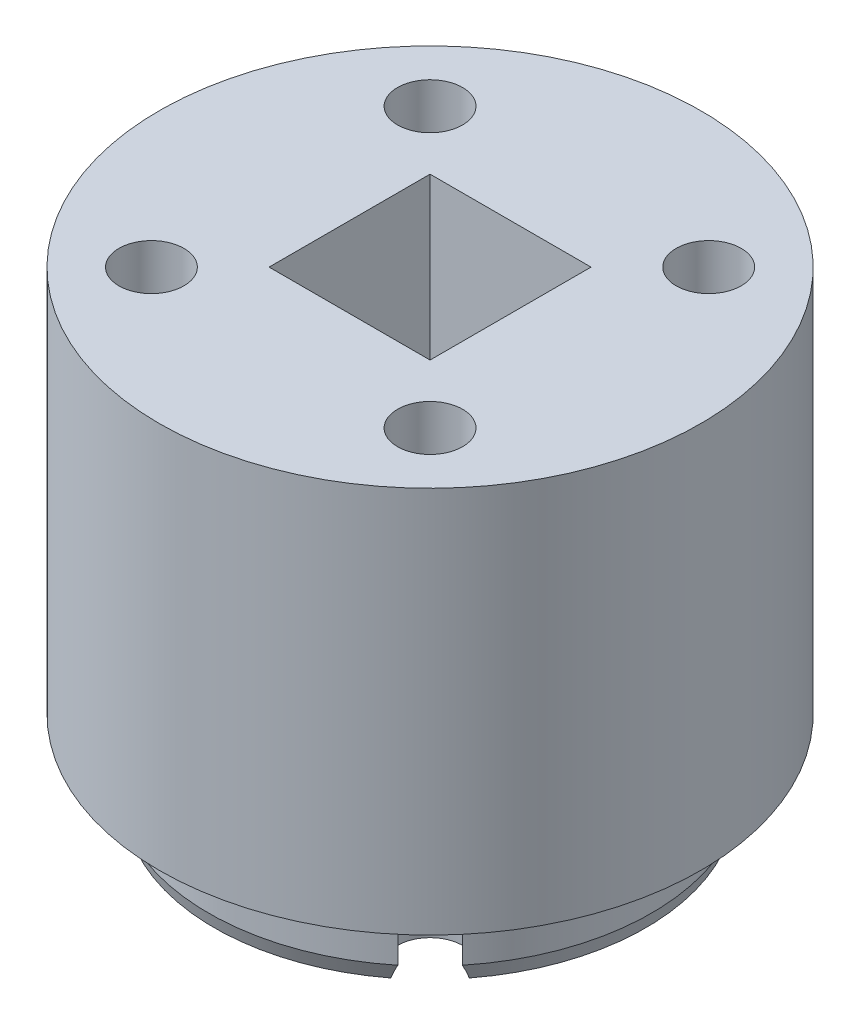
ISO-10303-21;
HEADER;
FILE_DESCRIPTION(('STEP AP214'),'2;1');
FILE_NAME('part.step','',(''),(''),'','','');
FILE_SCHEMA(('AUTOMOTIVE_DESIGN { 1 0 10303 214 1 1 1 1 }'));
ENDSEC;
DATA;
#1=APPLICATION_CONTEXT('core data for automotive mechanical design processes');
#2=APPLICATION_PROTOCOL_DEFINITION('international standard','automotive_design',2000,#1);
#3=PRODUCT_CONTEXT('',#1,'mechanical');
#4=PRODUCT('Part','Part','',(#3));
#5=PRODUCT_RELATED_PRODUCT_CATEGORY('part','',(#4));
#6=PRODUCT_DEFINITION_FORMATION('','',#4);
#7=PRODUCT_DEFINITION_CONTEXT('part definition',#1,'design');
#8=PRODUCT_DEFINITION('design','',#6,#7);
#9=PRODUCT_DEFINITION_SHAPE('','',#8);
#10=(LENGTH_UNIT() NAMED_UNIT(*) SI_UNIT(.MILLI.,.METRE.));
#11=(NAMED_UNIT(*) PLANE_ANGLE_UNIT() SI_UNIT($,.RADIAN.));
#12=(NAMED_UNIT(*) SI_UNIT($,.STERADIAN.) SOLID_ANGLE_UNIT());
#13=UNCERTAINTY_MEASURE_WITH_UNIT(LENGTH_MEASURE(1.E-05),#10,'distance_accuracy_value','');
#14=(GEOMETRIC_REPRESENTATION_CONTEXT(3) GLOBAL_UNCERTAINTY_ASSIGNED_CONTEXT((#13)) GLOBAL_UNIT_ASSIGNED_CONTEXT((#10,
#11,#12)) REPRESENTATION_CONTEXT('',''));
#15=CARTESIAN_POINT('',(0.,0.,0.));
#16=DIRECTION('',(0.,0.,1.));
#17=DIRECTION('',(1.,0.,0.));
#18=AXIS2_PLACEMENT_3D('',#15,#16,#17);
#19=CARTESIAN_POINT('',(0.,-5.,0.));
#20=DIRECTION('',(0.,1.,0.));
#21=DIRECTION('',(0.,0.,1.));
#22=AXIS2_PLACEMENT_3D('',#19,#20,#21);
#23=CYLINDRICAL_SURFACE('',#22,14.3);
#24=DIRECTION('',(0.,1.,0.));
#25=VECTOR('',#24,1.);
#26=CARTESIAN_POINT('',(-9.01561360028965,10.,11.0999419552659));
#27=LINE('',#26,#25);
#28=CARTESIAN_POINT('',(-9.01561360028965,0.,11.0999419552659));
#29=VERTEX_POINT('',#28);
#30=CARTESIAN_POINT('',(-9.01561360028965,-3.99999999999996,11.0999419552659));
#31=VERTEX_POINT('',#30);
#32=EDGE_CURVE('E211',#29,#31,#27,.F.);
#33=ORIENTED_EDGE('',*,*,#32,.T.);
#34=CARTESIAN_POINT('',(0.,-3.99999999999996,0.));
#35=DIRECTION('',(0.,-1.,0.));
#36=DIRECTION('',(0.,0.,-1.));
#37=AXIS2_PLACEMENT_3D('',#34,#35,#36);
#38=CIRCLE('',#37,14.3);
#39=CARTESIAN_POINT('',(9.01561360028965,-3.99999999999996,11.0999419552659));
#40=VERTEX_POINT('',#39);
#41=EDGE_CURVE('E11',#31,#40,#38,.F.);
#42=ORIENTED_EDGE('',*,*,#41,.T.);
#43=DIRECTION('',(0.,1.,0.));
#44=VECTOR('',#43,1.);
#45=CARTESIAN_POINT('',(9.01561360028965,10.,11.0999419552659));
#46=LINE('',#45,#44);
#47=CARTESIAN_POINT('',(9.01561360028965,0.,11.0999419552659));
#48=VERTEX_POINT('',#47);
#49=EDGE_CURVE('E216',#40,#48,#46,.T.);
#50=ORIENTED_EDGE('',*,*,#49,.T.);
#51=CARTESIAN_POINT('',(0.,0.,0.));
#52=DIRECTION('',(0.,1.,0.));
#53=DIRECTION('',(0.,0.,1.));
#54=AXIS2_PLACEMENT_3D('',#51,#52,#53);
#55=CIRCLE('',#54,14.3);
#56=EDGE_CURVE('E179',#48,#29,#55,.F.);
#57=ORIENTED_EDGE('',*,*,#56,.T.);
#58=EDGE_LOOP('',(#33,#42,#50,#57));
#59=FACE_BOUND('',#58,.T.);
#60=ADVANCED_FACE('F34',(#59),#23,.T.);
#61=DIRECTION('',(0.,1.,0.));
#62=VECTOR('',#61,1.);
#63=CARTESIAN_POINT('',(-11.0999419552659,10.,-9.01561360028966));
#64=LINE('',#63,#62);
#65=CARTESIAN_POINT('',(-11.0999419552659,0.,-9.01561360028966));
#66=VERTEX_POINT('',#65);
#67=CARTESIAN_POINT('',(-11.0999419552659,-3.99999999999996,-9.01561360028966));
#68=VERTEX_POINT('',#67);
#69=EDGE_CURVE('E193',#66,#68,#64,.F.);
#70=ORIENTED_EDGE('',*,*,#69,.T.);
#71=CARTESIAN_POINT('',(0.,-3.99999999999996,0.));
#72=DIRECTION('',(0.,-1.,0.));
#73=DIRECTION('',(0.,0.,-1.));
#74=AXIS2_PLACEMENT_3D('',#71,#72,#73);
#75=CIRCLE('',#74,14.3);
#76=CARTESIAN_POINT('',(-11.0999419552659,-3.99999999999996,9.01561360028965));
#77=VERTEX_POINT('',#76);
#78=EDGE_CURVE('E58',#68,#77,#75,.F.);
#79=ORIENTED_EDGE('',*,*,#78,.T.);
#80=DIRECTION('',(0.,1.,0.));
#81=VECTOR('',#80,1.);
#82=CARTESIAN_POINT('',(-11.0999419552659,10.,9.01561360028965));
#83=LINE('',#82,#81);
#84=CARTESIAN_POINT('',(-11.0999419552659,0.,9.01561360028965));
#85=VERTEX_POINT('',#84);
#86=EDGE_CURVE('E194',#77,#85,#83,.T.);
#87=ORIENTED_EDGE('',*,*,#86,.T.);
#88=EDGE_CURVE('E180',#85,#66,#55,.F.);
#89=ORIENTED_EDGE('',*,*,#88,.T.);
#90=EDGE_LOOP('',(#70,#79,#87,#89));
#91=FACE_BOUND('',#90,.T.);
#92=ADVANCED_FACE('F192',(#91),#23,.T.);
#93=DIRECTION('',(0.,1.,0.));
#94=VECTOR('',#93,1.);
#95=CARTESIAN_POINT('',(9.01561360028965,10.,-11.0999419552659));
#96=LINE('',#95,#94);
#97=CARTESIAN_POINT('',(9.01561360028965,0.,-11.0999419552659));
#98=VERTEX_POINT('',#97);
#99=CARTESIAN_POINT('',(9.01561360028965,-3.99999999999996,-11.0999419552659));
#100=VERTEX_POINT('',#99);
#101=EDGE_CURVE('E164',#98,#100,#96,.F.);
#102=ORIENTED_EDGE('',*,*,#101,.T.);
#103=CARTESIAN_POINT('',(0.,-3.99999999999996,0.));
#104=DIRECTION('',(0.,-1.,0.));
#105=DIRECTION('',(0.,0.,-1.));
#106=AXIS2_PLACEMENT_3D('',#103,#104,#105);
#107=CIRCLE('',#106,14.3);
#108=CARTESIAN_POINT('',(-9.01561360028966,-3.99999999999996,-11.0999419552659));
#109=VERTEX_POINT('',#108);
#110=EDGE_CURVE('E330',#100,#109,#107,.F.);
#111=ORIENTED_EDGE('',*,*,#110,.T.);
#112=DIRECTION('',(0.,1.,0.));
#113=VECTOR('',#112,1.);
#114=CARTESIAN_POINT('',(-9.01561360028966,10.,-11.0999419552659));
#115=LINE('',#114,#113);
#116=CARTESIAN_POINT('',(-9.01561360028966,0.,-11.0999419552659));
#117=VERTEX_POINT('',#116);
#118=EDGE_CURVE('E203',#109,#117,#115,.T.);
#119=ORIENTED_EDGE('',*,*,#118,.T.);
#120=EDGE_CURVE('E176',#117,#98,#55,.F.);
#121=ORIENTED_EDGE('',*,*,#120,.T.);
#122=EDGE_LOOP('',(#102,#111,#119,#121));
#123=FACE_BOUND('',#122,.T.);
#124=ADVANCED_FACE('F265',(#123),#23,.T.);
#125=CARTESIAN_POINT('',(0.,25.,0.));
#126=DIRECTION('',(0.,-1.,0.));
#127=DIRECTION('',(0.,0.,-1.));
#128=AXIS2_PLACEMENT_3D('',#125,#126,#127);
#129=CYLINDRICAL_SURFACE('',#128,17.5);
#130=CARTESIAN_POINT('',(0.,25.,0.));
#131=DIRECTION('',(0.,1.,0.));
#132=DIRECTION('',(0.,0.,1.));
#133=AXIS2_PLACEMENT_3D('',#130,#131,#132);
#134=CIRCLE('',#133,17.5);
#135=CARTESIAN_POINT('',(0.,25.,17.5));
#136=VERTEX_POINT('',#135);
#137=EDGE_CURVE('E177',#136,#136,#134,.T.);
#138=ORIENTED_EDGE('',*,*,#137,.F.);
#139=EDGE_LOOP('',(#138));
#140=FACE_BOUND('',#139,.T.);
#141=CARTESIAN_POINT('',(0.,0.,0.));
#142=DIRECTION('',(0.,1.,0.));
#143=DIRECTION('',(0.,0.,1.));
#144=AXIS2_PLACEMENT_3D('',#141,#142,#143);
#145=CIRCLE('',#144,17.5);
#146=CARTESIAN_POINT('',(0.,0.,17.5));
#147=VERTEX_POINT('',#146);
#148=EDGE_CURVE('E182',#147,#147,#145,.T.);
#149=ORIENTED_EDGE('',*,*,#148,.T.);
#150=EDGE_LOOP('',(#149));
#151=FACE_BOUND('',#150,.T.);
#152=ADVANCED_FACE('F255',(#140,#151),#129,.T.);
#153=CARTESIAN_POINT('',(0.,25.,0.));
#154=DIRECTION('',(0.,1.,0.));
#155=DIRECTION('',(0.,0.,1.));
#156=AXIS2_PLACEMENT_3D('',#153,#154,#155);
#157=PLANE('',#156);
#158=CARTESIAN_POINT('',(-9.,25.,9.));
#159=DIRECTION('',(0.,1.,0.));
#160=DIRECTION('',(0.,0.,1.));
#161=AXIS2_PLACEMENT_3D('',#158,#159,#160);
#162=CIRCLE('',#161,2.1);
#163=CARTESIAN_POINT('',(-9.,25.,11.1));
#164=VERTEX_POINT('',#163);
#165=EDGE_CURVE('E159',#164,#164,#162,.T.);
#166=ORIENTED_EDGE('',*,*,#165,.F.);
#167=EDGE_LOOP('',(#166));
#168=FACE_BOUND('',#167,.T.);
#169=CARTESIAN_POINT('',(-9.00000000000001,25.,-9.));
#170=DIRECTION('',(0.,1.,0.));
#171=DIRECTION('',(0.,0.,1.));
#172=AXIS2_PLACEMENT_3D('',#169,#170,#171);
#173=CIRCLE('',#172,2.1);
#174=CARTESIAN_POINT('',(-9.00000000000001,25.,-6.9));
#175=VERTEX_POINT('',#174);
#176=EDGE_CURVE('E533',#175,#175,#173,.T.);
#177=ORIENTED_EDGE('',*,*,#176,.F.);
#178=EDGE_LOOP('',(#177));
#179=FACE_BOUND('',#178,.T.);
#180=CARTESIAN_POINT('',(9.,25.,-9.));
#181=DIRECTION('',(0.,1.,0.));
#182=DIRECTION('',(0.,0.,1.));
#183=AXIS2_PLACEMENT_3D('',#180,#181,#182);
#184=CIRCLE('',#183,2.1);
#185=CARTESIAN_POINT('',(9.,25.,-6.9));
#186=VERTEX_POINT('',#185);
#187=EDGE_CURVE('E530',#186,#186,#184,.T.);
#188=ORIENTED_EDGE('',*,*,#187,.F.);
#189=EDGE_LOOP('',(#188));
#190=FACE_BOUND('',#189,.T.);
#191=CARTESIAN_POINT('',(9.,25.,9.));
#192=DIRECTION('',(0.,1.,0.));
#193=DIRECTION('',(0.,0.,1.));
#194=AXIS2_PLACEMENT_3D('',#191,#192,#193);
#195=CIRCLE('',#194,2.1);
#196=CARTESIAN_POINT('',(9.,25.,11.1));
#197=VERTEX_POINT('',#196);
#198=EDGE_CURVE('E213',#197,#197,#195,.T.);
#199=ORIENTED_EDGE('',*,*,#198,.F.);
#200=EDGE_LOOP('',(#199));
#201=FACE_BOUND('',#200,.T.);
#202=DIRECTION('',(0.,0.,-1.));
#203=VECTOR('',#202,1.);
#204=CARTESIAN_POINT('',(5.2,25.,-5.2));
#205=LINE('',#204,#203);
#206=CARTESIAN_POINT('',(5.2,25.,5.2));
#207=VERTEX_POINT('',#206);
#208=CARTESIAN_POINT('',(5.2,25.,-5.2));
#209=VERTEX_POINT('',#208);
#210=EDGE_CURVE('E221',#207,#209,#205,.T.);
#211=ORIENTED_EDGE('',*,*,#210,.F.);
#212=DIRECTION('',(1.,0.,0.));
#213=VECTOR('',#212,1.);
#214=CARTESIAN_POINT('',(-5.2,25.,5.2));
#215=LINE('',#214,#213);
#216=CARTESIAN_POINT('',(-5.2,25.,5.2));
#217=VERTEX_POINT('',#216);
#218=EDGE_CURVE('E226',#217,#207,#215,.T.);
#219=ORIENTED_EDGE('',*,*,#218,.F.);
#220=DIRECTION('',(0.,0.,1.));
#221=VECTOR('',#220,1.);
#222=CARTESIAN_POINT('',(-5.2,25.,-5.2));
#223=LINE('',#222,#221);
#224=CARTESIAN_POINT('',(-5.2,25.,-5.2));
#225=VERTEX_POINT('',#224);
#226=EDGE_CURVE('E240',#225,#217,#223,.T.);
#227=ORIENTED_EDGE('',*,*,#226,.F.);
#228=DIRECTION('',(-1.,0.,0.));
#229=VECTOR('',#228,1.);
#230=CARTESIAN_POINT('',(-5.2,25.,-5.2));
#231=LINE('',#230,#229);
#232=EDGE_CURVE('E237',#209,#225,#231,.T.);
#233=ORIENTED_EDGE('',*,*,#232,.F.);
#234=EDGE_LOOP('',(#211,#219,#227,#233));
#235=FACE_BOUND('',#234,.T.);
#236=ORIENTED_EDGE('',*,*,#137,.T.);
#237=EDGE_LOOP('',(#236));
#238=FACE_BOUND('',#237,.T.);
#239=ADVANCED_FACE('F257',(#168,#179,#190,#201,#235,#238),#157,.T.);
#240=CARTESIAN_POINT('',(0.,0.,0.));
#241=DIRECTION('',(0.,1.,0.));
#242=DIRECTION('',(0.,0.,1.));
#243=AXIS2_PLACEMENT_3D('',#240,#241,#242);
#244=PLANE('',#243);
#245=ORIENTED_EDGE('',*,*,#88,.F.);
#246=CARTESIAN_POINT('',(-9.,0.,9.));
#247=DIRECTION('',(0.,1.,0.));
#248=DIRECTION('',(0.,0.,1.));
#249=AXIS2_PLACEMENT_3D('',#246,#247,#248);
#250=CIRCLE('',#249,2.1);
#251=EDGE_CURVE('E198',#85,#29,#250,.T.);
#252=ORIENTED_EDGE('',*,*,#251,.T.);
#253=ORIENTED_EDGE('',*,*,#56,.F.);
#254=CARTESIAN_POINT('',(9.,0.,9.));
#255=DIRECTION('',(0.,1.,0.));
#256=DIRECTION('',(0.,0.,1.));
#257=AXIS2_PLACEMENT_3D('',#254,#255,#256);
#258=CIRCLE('',#257,2.1);
#259=CARTESIAN_POINT('',(11.0999419552659,0.,9.01561360028965));
#260=VERTEX_POINT('',#259);
#261=EDGE_CURVE('E175',#48,#260,#258,.T.);
#262=ORIENTED_EDGE('',*,*,#261,.T.);
#263=CARTESIAN_POINT('',(11.0999419552659,0.,-9.01561360028965));
#264=VERTEX_POINT('',#263);
#265=EDGE_CURVE('E152',#264,#260,#55,.F.);
#266=ORIENTED_EDGE('',*,*,#265,.F.);
#267=CARTESIAN_POINT('',(9.,0.,-9.));
#268=DIRECTION('',(0.,1.,0.));
#269=DIRECTION('',(0.,0.,1.));
#270=AXIS2_PLACEMENT_3D('',#267,#268,#269);
#271=CIRCLE('',#270,2.1);
#272=EDGE_CURVE('E158',#264,#98,#271,.T.);
#273=ORIENTED_EDGE('',*,*,#272,.T.);
#274=ORIENTED_EDGE('',*,*,#120,.F.);
#275=CARTESIAN_POINT('',(-9.00000000000001,0.,-9.));
#276=DIRECTION('',(0.,1.,0.));
#277=DIRECTION('',(0.,0.,1.));
#278=AXIS2_PLACEMENT_3D('',#275,#276,#277);
#279=CIRCLE('',#278,2.1);
#280=EDGE_CURVE('E200',#117,#66,#279,.T.);
#281=ORIENTED_EDGE('',*,*,#280,.T.);
#282=EDGE_LOOP('',(#245,#252,#253,#262,#266,#273,#274,#281));
#283=FACE_BOUND('',#282,.T.);
#284=ORIENTED_EDGE('',*,*,#148,.F.);
#285=EDGE_LOOP('',(#284));
#286=FACE_BOUND('',#285,.T.);
#287=ADVANCED_FACE('F171',(#283,#286),#244,.F.);
#288=DIRECTION('',(0.,1.,0.));
#289=VECTOR('',#288,1.);
#290=CARTESIAN_POINT('',(11.0999419552659,10.,9.01561360028965));
#291=LINE('',#290,#289);
#292=CARTESIAN_POINT('',(11.0999419552659,-3.99999999999996,9.01561360028965));
#293=VERTEX_POINT('',#292);
#294=EDGE_CURVE('E219',#260,#293,#291,.F.);
#295=ORIENTED_EDGE('',*,*,#294,.T.);
#296=CARTESIAN_POINT('',(0.,-3.99999999999996,0.));
#297=DIRECTION('',(0.,-1.,0.));
#298=DIRECTION('',(0.,0.,-1.));
#299=AXIS2_PLACEMENT_3D('',#296,#297,#298);
#300=CIRCLE('',#299,14.3);
#301=CARTESIAN_POINT('',(11.0999419552659,-3.99999999999996,-9.01561360028965));
#302=VERTEX_POINT('',#301);
#303=EDGE_CURVE('E155',#293,#302,#300,.F.);
#304=ORIENTED_EDGE('',*,*,#303,.T.);
#305=DIRECTION('',(0.,1.,0.));
#306=VECTOR('',#305,1.);
#307=CARTESIAN_POINT('',(11.0999419552659,10.,-9.01561360028965));
#308=LINE('',#307,#306);
#309=EDGE_CURVE('E147',#302,#264,#308,.T.);
#310=ORIENTED_EDGE('',*,*,#309,.T.);
#311=ORIENTED_EDGE('',*,*,#265,.T.);
#312=EDGE_LOOP('',(#295,#304,#310,#311));
#313=FACE_BOUND('',#312,.T.);
#314=ADVANCED_FACE('F150',(#313),#23,.T.);
#315=CARTESIAN_POINT('',(0.,-5.,0.));
#316=DIRECTION('',(0.,-1.,0.));
#317=DIRECTION('',(0.,0.,-1.));
#318=AXIS2_PLACEMENT_3D('',#315,#316,#317);
#319=PLANE('',#318);
#320=CARTESIAN_POINT('',(9.,-5.,-9.));
#321=DIRECTION('',(0.,-1.,0.));
#322=DIRECTION('',(0.,0.,-1.));
#323=AXIS2_PLACEMENT_3D('',#320,#321,#322);
#324=CIRCLE('',#323,2.1);
#325=CARTESIAN_POINT('',(11.0405886783931,-5.,-8.50401830113012));
#326=VERTEX_POINT('',#325);
#327=CARTESIAN_POINT('',(8.50401830113012,-5.,-11.0405886783931));
#328=VERTEX_POINT('',#327);
#329=EDGE_CURVE('E190',#326,#328,#324,.T.);
#330=ORIENTED_EDGE('',*,*,#329,.F.);
#331=CARTESIAN_POINT('',(0.,-5.,0.));
#332=DIRECTION('',(0.,-1.,0.));
#333=DIRECTION('',(0.,0.,-1.));
#334=AXIS2_PLACEMENT_3D('',#331,#332,#333);
#335=CIRCLE('',#334,13.9360297657338);
#336=CARTESIAN_POINT('',(11.0405886783931,-5.,8.50401830113012));
#337=VERTEX_POINT('',#336);
#338=EDGE_CURVE('E384',#326,#337,#335,.T.);
#339=ORIENTED_EDGE('',*,*,#338,.T.);
#340=CARTESIAN_POINT('',(9.,-5.,9.));
#341=DIRECTION('',(0.,-1.,0.));
#342=DIRECTION('',(0.,0.,-1.));
#343=AXIS2_PLACEMENT_3D('',#340,#341,#342);
#344=CIRCLE('',#343,2.1);
#345=CARTESIAN_POINT('',(8.50401830113012,-5.,11.0405886783931));
#346=VERTEX_POINT('',#345);
#347=EDGE_CURVE('E187',#346,#337,#344,.T.);
#348=ORIENTED_EDGE('',*,*,#347,.F.);
#349=CARTESIAN_POINT('',(0.,-5.,0.));
#350=DIRECTION('',(0.,-1.,0.));
#351=DIRECTION('',(0.,0.,-1.));
#352=AXIS2_PLACEMENT_3D('',#349,#350,#351);
#353=CIRCLE('',#352,13.9360297657338);
#354=CARTESIAN_POINT('',(-8.50401830113012,-5.,11.0405886783931));
#355=VERTEX_POINT('',#354);
#356=EDGE_CURVE('E387',#346,#355,#353,.T.);
#357=ORIENTED_EDGE('',*,*,#356,.T.);
#358=CARTESIAN_POINT('',(-9.,-5.,9.));
#359=DIRECTION('',(0.,-1.,0.));
#360=DIRECTION('',(0.,0.,-1.));
#361=AXIS2_PLACEMENT_3D('',#358,#359,#360);
#362=CIRCLE('',#361,2.1);
#363=CARTESIAN_POINT('',(-11.0405886783931,-5.,8.50401830113012));
#364=VERTEX_POINT('',#363);
#365=EDGE_CURVE('E382',#364,#355,#362,.T.);
#366=ORIENTED_EDGE('',*,*,#365,.F.);
#367=CARTESIAN_POINT('',(0.,-5.,0.));
#368=DIRECTION('',(0.,-1.,0.));
#369=DIRECTION('',(0.,0.,-1.));
#370=AXIS2_PLACEMENT_3D('',#367,#368,#369);
#371=CIRCLE('',#370,13.9360297657338);
#372=CARTESIAN_POINT('',(-11.0405886783931,-5.,-8.50401830113012));
#373=VERTEX_POINT('',#372);
#374=EDGE_CURVE('E381',#364,#373,#371,.T.);
#375=ORIENTED_EDGE('',*,*,#374,.T.);
#376=CARTESIAN_POINT('',(-9.00000000000001,-5.,-9.));
#377=DIRECTION('',(0.,-1.,0.));
#378=DIRECTION('',(0.,0.,-1.));
#379=AXIS2_PLACEMENT_3D('',#376,#377,#378);
#380=CIRCLE('',#379,2.1);
#381=CARTESIAN_POINT('',(-8.50401830113013,-5.,-11.0405886783931));
#382=VERTEX_POINT('',#381);
#383=EDGE_CURVE('E370',#382,#373,#380,.T.);
#384=ORIENTED_EDGE('',*,*,#383,.F.);
#385=CARTESIAN_POINT('',(0.,-5.,0.));
#386=DIRECTION('',(0.,-1.,0.));
#387=DIRECTION('',(0.,0.,-1.));
#388=AXIS2_PLACEMENT_3D('',#385,#386,#387);
#389=CIRCLE('',#388,13.9360297657338);
#390=EDGE_CURVE('E378',#382,#328,#389,.T.);
#391=ORIENTED_EDGE('',*,*,#390,.T.);
#392=EDGE_LOOP('',(#330,#339,#348,#357,#366,#375,#384,#391));
#393=FACE_BOUND('',#392,.T.);
#394=DIRECTION('',(0.,0.,-1.));
#395=VECTOR('',#394,1.);
#396=CARTESIAN_POINT('',(5.2,-5.,-5.2));
#397=LINE('',#396,#395);
#398=CARTESIAN_POINT('',(5.2,-5.,5.2));
#399=VERTEX_POINT('',#398);
#400=CARTESIAN_POINT('',(5.2,-5.,-5.2));
#401=VERTEX_POINT('',#400);
#402=EDGE_CURVE('E222',#399,#401,#397,.T.);
#403=ORIENTED_EDGE('',*,*,#402,.T.);
#404=DIRECTION('',(-1.,0.,0.));
#405=VECTOR('',#404,1.);
#406=CARTESIAN_POINT('',(-5.2,-5.,-5.2));
#407=LINE('',#406,#405);
#408=CARTESIAN_POINT('',(-5.2,-5.,-5.2));
#409=VERTEX_POINT('',#408);
#410=EDGE_CURVE('E225',#401,#409,#407,.T.);
#411=ORIENTED_EDGE('',*,*,#410,.T.);
#412=DIRECTION('',(0.,0.,1.));
#413=VECTOR('',#412,1.);
#414=CARTESIAN_POINT('',(-5.2,-5.,-5.2));
#415=LINE('',#414,#413);
#416=CARTESIAN_POINT('',(-5.2,-5.,5.2));
#417=VERTEX_POINT('',#416);
#418=EDGE_CURVE('E229',#409,#417,#415,.T.);
#419=ORIENTED_EDGE('',*,*,#418,.T.);
#420=DIRECTION('',(1.,0.,0.));
#421=VECTOR('',#420,1.);
#422=CARTESIAN_POINT('',(-5.2,-5.,5.2));
#423=LINE('',#422,#421);
#424=EDGE_CURVE('E232',#417,#399,#423,.T.);
#425=ORIENTED_EDGE('',*,*,#424,.T.);
#426=EDGE_LOOP('',(#403,#411,#419,#425));
#427=FACE_BOUND('',#426,.T.);
#428=ADVANCED_FACE('F263',(#393,#427),#319,.T.);
#429=CARTESIAN_POINT('',(5.2,-5.,-5.2));
#430=DIRECTION('',(1.,0.,0.));
#431=DIRECTION('',(0.,0.,-1.));
#432=AXIS2_PLACEMENT_3D('',#429,#430,#431);
#433=PLANE('',#432);
#434=ORIENTED_EDGE('',*,*,#210,.T.);
#435=DIRECTION('',(0.,1.,0.));
#436=VECTOR('',#435,1.);
#437=CARTESIAN_POINT('',(5.2,-5.,-5.2));
#438=LINE('',#437,#436);
#439=EDGE_CURVE('E235',#401,#209,#438,.T.);
#440=ORIENTED_EDGE('',*,*,#439,.F.);
#441=ORIENTED_EDGE('',*,*,#402,.F.);
#442=DIRECTION('',(0.,1.,0.));
#443=VECTOR('',#442,1.);
#444=CARTESIAN_POINT('',(5.2,-5.,5.2));
#445=LINE('',#444,#443);
#446=EDGE_CURVE('E245',#399,#207,#445,.T.);
#447=ORIENTED_EDGE('',*,*,#446,.T.);
#448=EDGE_LOOP('',(#434,#440,#441,#447));
#449=FACE_BOUND('',#448,.T.);
#450=ADVANCED_FACE('F276',(#449),#433,.F.);
#451=CARTESIAN_POINT('',(-5.2,-5.,5.2));
#452=DIRECTION('',(0.,0.,1.));
#453=DIRECTION('',(1.,0.,0.));
#454=AXIS2_PLACEMENT_3D('',#451,#452,#453);
#455=PLANE('',#454);
#456=ORIENTED_EDGE('',*,*,#218,.T.);
#457=ORIENTED_EDGE('',*,*,#446,.F.);
#458=ORIENTED_EDGE('',*,*,#424,.F.);
#459=DIRECTION('',(0.,1.,0.));
#460=VECTOR('',#459,1.);
#461=CARTESIAN_POINT('',(-5.2,-5.,5.2));
#462=LINE('',#461,#460);
#463=EDGE_CURVE('E247',#417,#217,#462,.T.);
#464=ORIENTED_EDGE('',*,*,#463,.T.);
#465=EDGE_LOOP('',(#456,#457,#458,#464));
#466=FACE_BOUND('',#465,.T.);
#467=ADVANCED_FACE('F280',(#466),#455,.F.);
#468=CARTESIAN_POINT('',(-5.2,-5.,-5.2));
#469=DIRECTION('',(-1.,0.,0.));
#470=DIRECTION('',(0.,0.,1.));
#471=AXIS2_PLACEMENT_3D('',#468,#469,#470);
#472=PLANE('',#471);
#473=ORIENTED_EDGE('',*,*,#226,.T.);
#474=ORIENTED_EDGE('',*,*,#463,.F.);
#475=ORIENTED_EDGE('',*,*,#418,.F.);
#476=DIRECTION('',(0.,1.,0.));
#477=VECTOR('',#476,1.);
#478=CARTESIAN_POINT('',(-5.2,-5.,-5.2));
#479=LINE('',#478,#477);
#480=EDGE_CURVE('E249',#409,#225,#479,.T.);
#481=ORIENTED_EDGE('',*,*,#480,.T.);
#482=EDGE_LOOP('',(#473,#474,#475,#481));
#483=FACE_BOUND('',#482,.T.);
#484=ADVANCED_FACE('F286',(#483),#472,.F.);
#485=CARTESIAN_POINT('',(-5.2,-5.,-5.2));
#486=DIRECTION('',(0.,0.,-1.));
#487=DIRECTION('',(-1.,0.,0.));
#488=AXIS2_PLACEMENT_3D('',#485,#486,#487);
#489=PLANE('',#488);
#490=ORIENTED_EDGE('',*,*,#232,.T.);
#491=ORIENTED_EDGE('',*,*,#480,.F.);
#492=ORIENTED_EDGE('',*,*,#410,.F.);
#493=ORIENTED_EDGE('',*,*,#439,.T.);
#494=EDGE_LOOP('',(#490,#491,#492,#493));
#495=FACE_BOUND('',#494,.T.);
#496=ADVANCED_FACE('F282',(#495),#489,.F.);
#497=CARTESIAN_POINT('',(9.,-5.,9.));
#498=DIRECTION('',(0.,1.,0.));
#499=DIRECTION('',(0.,0.,1.));
#500=AXIS2_PLACEMENT_3D('',#497,#498,#499);
#501=CYLINDRICAL_SURFACE('',#500,2.1);
#502=ORIENTED_EDGE('',*,*,#198,.T.);
#503=EDGE_LOOP('',(#502));
#504=FACE_BOUND('',#503,.T.);
#505=ORIENTED_EDGE('',*,*,#347,.T.);
#506=CARTESIAN_POINT('',(11.0405886783931,-5.,8.50401830113012));
#507=CARTESIAN_POINT('',(11.0499545676476,-4.91493811539205,8.54259198023782));
#508=CARTESIAN_POINT('',(11.058402714514,-4.83017646144863,8.58207469876669));
#509=CARTESIAN_POINT('',(11.0731877373282,-4.66152998844149,8.6629681391772));
#510=CARTESIAN_POINT('',(11.0795273308279,-4.57764417677162,8.70437630038979));
#511=CARTESIAN_POINT('',(11.0898454861572,-4.41079805324542,8.78933295911781));
#512=CARTESIAN_POINT('',(11.0938238575059,-4.32783781658519,8.8328816290023));
#513=CARTESIAN_POINT('',(11.0990402263277,-4.16300667630184,8.92239255111969));
#514=CARTESIAN_POINT('',(11.1002746630819,-4.08113732498703,8.96835786031146));
#515=CARTESIAN_POINT('',(11.0999419552659,-3.99999999999997,9.01561360028965));
#516=B_SPLINE_CURVE_WITH_KNOTS('',3,(#506,#507,#508,#509,#510,#511,#512,#513,#514,#515),
.UNSPECIFIED.,.F.,.F.,(4,2,2,2,4),(0.,0.281608129885989,0.56285189749213,0.844118350077896,
1.12574958086594),.UNSPECIFIED.);
#517=EDGE_CURVE('E308',#337,#293,#516,.T.);
#518=ORIENTED_EDGE('',*,*,#517,.T.);
#519=ORIENTED_EDGE('',*,*,#294,.F.);
#520=ORIENTED_EDGE('',*,*,#261,.F.);
#521=ORIENTED_EDGE('',*,*,#49,.F.);
#522=CARTESIAN_POINT('',(9.01561360028965,-3.99999999999996,11.0999419552659));
#523=CARTESIAN_POINT('',(8.96835786031146,-4.08113732498703,11.1002746630819));
#524=CARTESIAN_POINT('',(8.92239255111969,-4.16300667630184,11.0990402263277));
#525=CARTESIAN_POINT('',(8.8328816290023,-4.32783781658519,11.0938238575059));
#526=CARTESIAN_POINT('',(8.78933295911782,-4.41079805324542,11.0898454861572));
#527=CARTESIAN_POINT('',(8.70437630038979,-4.57764417677162,11.0795273308279));
#528=CARTESIAN_POINT('',(8.6629681391772,-4.66152998844149,11.0731877373282));
#529=CARTESIAN_POINT('',(8.58207469876669,-4.83017646144863,11.058402714514));
#530=CARTESIAN_POINT('',(8.54259198023782,-4.91493811539205,11.0499545676476));
#531=CARTESIAN_POINT('',(8.50401830113013,-5.,11.0405886783931));
#532=B_SPLINE_CURVE_WITH_KNOTS('',3,(#522,#523,#524,#525,#526,#527,#528,#529,#530,#531),
.UNSPECIFIED.,.F.,.F.,(4,2,2,2,4),(0.,0.281631230788038,0.562897683373805,0.844141450979946,
1.12574958086593),.UNSPECIFIED.);
#533=EDGE_CURVE('E302',#40,#346,#532,.T.);
#534=ORIENTED_EDGE('',*,*,#533,.T.);
#535=EDGE_LOOP('',(#505,#518,#519,#520,#521,#534));
#536=FACE_BOUND('',#535,.T.);
#537=ADVANCED_FACE('F285',(#504,#536),#501,.F.);
#538=CARTESIAN_POINT('',(9.,-5.,-9.));
#539=DIRECTION('',(0.,1.,0.));
#540=DIRECTION('',(0.,0.,1.));
#541=AXIS2_PLACEMENT_3D('',#538,#539,#540);
#542=CYLINDRICAL_SURFACE('',#541,2.1);
#543=ORIENTED_EDGE('',*,*,#187,.T.);
#544=EDGE_LOOP('',(#543));
#545=FACE_BOUND('',#544,.T.);
#546=ORIENTED_EDGE('',*,*,#309,.F.);
#547=CARTESIAN_POINT('',(11.0999419552659,-3.99999999999996,-9.01561360028965));
#548=CARTESIAN_POINT('',(11.1002746630819,-4.08113732498703,-8.96835786031146));
#549=CARTESIAN_POINT('',(11.0990402263277,-4.16300667630184,-8.92239255111969));
#550=CARTESIAN_POINT('',(11.0938238575059,-4.32783781658519,-8.8328816290023));
#551=CARTESIAN_POINT('',(11.0898454861572,-4.41079805324542,-8.78933295911781));
#552=CARTESIAN_POINT('',(11.0795273308279,-4.57764417677163,-8.70437630038979));
#553=CARTESIAN_POINT('',(11.0731877373282,-4.6615299884415,-8.6629681391772));
#554=CARTESIAN_POINT('',(11.058402714514,-4.83017646144863,-8.58207469876669));
#555=CARTESIAN_POINT('',(11.0499545676476,-4.91493811539205,-8.54259198023782));
#556=CARTESIAN_POINT('',(11.0405886783931,-5.,-8.50401830113012));
#557=B_SPLINE_CURVE_WITH_KNOTS('',3,(#547,#548,#549,#550,#551,#552,#553,#554,#555,#556),
.UNSPECIFIED.,.F.,.F.,(4,2,2,2,4),(0.,0.281631230788038,0.562897683373806,0.844141450979947,
1.12574958086594),.UNSPECIFIED.);
#558=EDGE_CURVE('E325',#302,#326,#557,.T.);
#559=ORIENTED_EDGE('',*,*,#558,.T.);
#560=ORIENTED_EDGE('',*,*,#329,.T.);
#561=CARTESIAN_POINT('',(8.50401830113012,-5.,-11.0405886783931));
#562=CARTESIAN_POINT('',(8.54259198023781,-4.91493811539205,-11.0499545676476));
#563=CARTESIAN_POINT('',(8.58207469876669,-4.83017646144863,-11.058402714514));
#564=CARTESIAN_POINT('',(8.6629681391772,-4.66152998844149,-11.0731877373282));
#565=CARTESIAN_POINT('',(8.70437630038978,-4.57764417677162,-11.0795273308279));
#566=CARTESIAN_POINT('',(8.78933295911781,-4.41079805324542,-11.0898454861572));
#567=CARTESIAN_POINT('',(8.8328816290023,-4.32783781658519,-11.0938238575059));
#568=CARTESIAN_POINT('',(8.92239255111969,-4.16300667630184,-11.0990402263277));
#569=CARTESIAN_POINT('',(8.96835786031146,-4.08113732498703,-11.1002746630819));
#570=CARTESIAN_POINT('',(9.01561360028965,-3.99999999999997,-11.0999419552659));
#571=B_SPLINE_CURVE_WITH_KNOTS('',3,(#561,#562,#563,#564,#565,#566,#567,#568,#569,#570),
.UNSPECIFIED.,.F.,.F.,(4,2,2,2,4),(0.,0.281608129885989,0.562851897492128,0.844118350077895,
1.12574958086593),.UNSPECIFIED.);
#572=EDGE_CURVE('E331',#328,#100,#571,.T.);
#573=ORIENTED_EDGE('',*,*,#572,.T.);
#574=ORIENTED_EDGE('',*,*,#101,.F.);
#575=ORIENTED_EDGE('',*,*,#272,.F.);
#576=EDGE_LOOP('',(#546,#559,#560,#573,#574,#575));
#577=FACE_BOUND('',#576,.T.);
#578=ADVANCED_FACE('F162',(#545,#577),#542,.F.);
#579=CARTESIAN_POINT('',(-9.00000000000001,-5.,-9.));
#580=DIRECTION('',(0.,1.,0.));
#581=DIRECTION('',(0.,0.,1.));
#582=AXIS2_PLACEMENT_3D('',#579,#580,#581);
#583=CYLINDRICAL_SURFACE('',#582,2.1);
#584=ORIENTED_EDGE('',*,*,#176,.T.);
#585=EDGE_LOOP('',(#584));
#586=FACE_BOUND('',#585,.T.);
#587=ORIENTED_EDGE('',*,*,#118,.F.);
#588=CARTESIAN_POINT('',(-9.01561360028966,-3.99999999999996,-11.0999419552659));
#589=CARTESIAN_POINT('',(-8.96835786031147,-4.08113732498703,-11.1002746630819));
#590=CARTESIAN_POINT('',(-8.92239255111969,-4.16300667630184,-11.0990402263277));
#591=CARTESIAN_POINT('',(-8.8328816290023,-4.32783781658519,-11.0938238575059));
#592=CARTESIAN_POINT('',(-8.78933295911782,-4.41079805324542,-11.0898454861572));
#593=CARTESIAN_POINT('',(-8.70437630038979,-4.57764417677162,-11.0795273308279));
#594=CARTESIAN_POINT('',(-8.6629681391772,-4.66152998844149,-11.0731877373282));
#595=CARTESIAN_POINT('',(-8.58207469876669,-4.83017646144863,-11.058402714514));
#596=CARTESIAN_POINT('',(-8.54259198023782,-4.91493811539205,-11.0499545676476));
#597=CARTESIAN_POINT('',(-8.50401830113013,-5.,-11.0405886783931));
#598=B_SPLINE_CURVE_WITH_KNOTS('',3,(#588,#589,#590,#591,#592,#593,#594,#595,#596,#597),
.UNSPECIFIED.,.F.,.F.,(4,2,2,2,4),(0.,0.281631230788041,0.562897683373808,0.84414145097995,
1.12574958086594),.UNSPECIFIED.);
#599=EDGE_CURVE('E341',#109,#382,#598,.T.);
#600=ORIENTED_EDGE('',*,*,#599,.T.);
#601=ORIENTED_EDGE('',*,*,#383,.T.);
#602=CARTESIAN_POINT('',(-11.0405886783931,-5.,-8.50401830113012));
#603=CARTESIAN_POINT('',(-11.0499545676476,-4.91493811539205,-8.54259198023782));
#604=CARTESIAN_POINT('',(-11.058402714514,-4.83017646144863,-8.58207469876669));
#605=CARTESIAN_POINT('',(-11.0731877373282,-4.66152998844149,-8.6629681391772));
#606=CARTESIAN_POINT('',(-11.0795273308279,-4.57764417677162,-8.70437630038978));
#607=CARTESIAN_POINT('',(-11.0898454861572,-4.41079805324542,-8.78933295911781));
#608=CARTESIAN_POINT('',(-11.0938238575059,-4.32783781658519,-8.8328816290023));
#609=CARTESIAN_POINT('',(-11.0990402263277,-4.16300667630184,-8.92239255111969));
#610=CARTESIAN_POINT('',(-11.1002746630819,-4.08113732498703,-8.96835786031146));
#611=CARTESIAN_POINT('',(-11.0999419552659,-3.99999999999996,-9.01561360028965));
#612=B_SPLINE_CURVE_WITH_KNOTS('',3,(#602,#603,#604,#605,#606,#607,#608,#609,#610,#611),
.UNSPECIFIED.,.F.,.F.,(4,2,2,2,4),(0.,0.281608129885989,0.56285189749213,0.844118350077897,
1.12574958086594),.UNSPECIFIED.);
#613=EDGE_CURVE('E336',#373,#68,#612,.T.);
#614=ORIENTED_EDGE('',*,*,#613,.T.);
#615=ORIENTED_EDGE('',*,*,#69,.F.);
#616=ORIENTED_EDGE('',*,*,#280,.F.);
#617=EDGE_LOOP('',(#587,#600,#601,#614,#615,#616));
#618=FACE_BOUND('',#617,.T.);
#619=ADVANCED_FACE('F348',(#586,#618),#583,.F.);
#620=CARTESIAN_POINT('',(-9.,-5.,9.));
#621=DIRECTION('',(0.,1.,0.));
#622=DIRECTION('',(0.,0.,1.));
#623=AXIS2_PLACEMENT_3D('',#620,#621,#622);
#624=CYLINDRICAL_SURFACE('',#623,2.1);
#625=ORIENTED_EDGE('',*,*,#165,.T.);
#626=EDGE_LOOP('',(#625));
#627=FACE_BOUND('',#626,.T.);
#628=ORIENTED_EDGE('',*,*,#86,.F.);
#629=CARTESIAN_POINT('',(-11.0999419552659,-3.99999999999996,9.01561360028965));
#630=CARTESIAN_POINT('',(-11.1002746630819,-4.08113732498703,8.96835786031146));
#631=CARTESIAN_POINT('',(-11.0990402263277,-4.16300667630185,8.92239255111969));
#632=CARTESIAN_POINT('',(-11.0938238575059,-4.32783781658519,8.8328816290023));
#633=CARTESIAN_POINT('',(-11.0898454861572,-4.41079805324542,8.78933295911781));
#634=CARTESIAN_POINT('',(-11.0795273308279,-4.57764417677162,8.70437630038978));
#635=CARTESIAN_POINT('',(-11.0731877373282,-4.66152998844149,8.6629681391772));
#636=CARTESIAN_POINT('',(-11.058402714514,-4.83017646144863,8.58207469876669));
#637=CARTESIAN_POINT('',(-11.0499545676476,-4.91493811539205,8.54259198023782));
#638=CARTESIAN_POINT('',(-11.0405886783931,-5.,8.50401830113012));
#639=B_SPLINE_CURVE_WITH_KNOTS('',3,(#629,#630,#631,#632,#633,#634,#635,#636,#637,#638),
.UNSPECIFIED.,.F.,.F.,(4,2,2,2,4),(0.,0.281631230788039,0.562897683373805,0.844141450979946,
1.12574958086593),.UNSPECIFIED.);
#640=EDGE_CURVE('E43',#77,#364,#639,.T.);
#641=ORIENTED_EDGE('',*,*,#640,.T.);
#642=ORIENTED_EDGE('',*,*,#365,.T.);
#643=CARTESIAN_POINT('',(-8.50401830113012,-5.,11.0405886783931));
#644=CARTESIAN_POINT('',(-8.54259198023782,-4.91493811539205,11.0499545676476));
#645=CARTESIAN_POINT('',(-8.58207469876669,-4.83017646144863,11.058402714514));
#646=CARTESIAN_POINT('',(-8.6629681391772,-4.66152998844149,11.0731877373282));
#647=CARTESIAN_POINT('',(-8.70437630038979,-4.57764417677162,11.0795273308279));
#648=CARTESIAN_POINT('',(-8.78933295911782,-4.41079805324542,11.0898454861572));
#649=CARTESIAN_POINT('',(-8.8328816290023,-4.32783781658519,11.0938238575059));
#650=CARTESIAN_POINT('',(-8.92239255111969,-4.16300667630184,11.0990402263277));
#651=CARTESIAN_POINT('',(-8.96835786031146,-4.08113732498703,11.1002746630819));
#652=CARTESIAN_POINT('',(-9.01561360028966,-3.99999999999997,11.0999419552659));
#653=B_SPLINE_CURVE_WITH_KNOTS('',3,(#643,#644,#645,#646,#647,#648,#649,#650,#651,#652),
.UNSPECIFIED.,.F.,.F.,(4,2,2,2,4),(0.,0.281608129885989,0.562851897492129,0.844118350077895,
1.12574958086594),.UNSPECIFIED.);
#654=EDGE_CURVE('E50',#355,#31,#653,.T.);
#655=ORIENTED_EDGE('',*,*,#654,.T.);
#656=ORIENTED_EDGE('',*,*,#32,.F.);
#657=ORIENTED_EDGE('',*,*,#251,.F.);
#658=EDGE_LOOP('',(#628,#641,#642,#655,#656,#657));
#659=FACE_BOUND('',#658,.T.);
#660=ADVANCED_FACE('F320',(#627,#659),#624,.F.);
#661=CARTESIAN_POINT('',(0.,-5.,0.));
#662=DIRECTION('',(0.,1.,0.));
#663=DIRECTION('',(0.,0.,1.));
#664=AXIS2_PLACEMENT_3D('',#661,#662,#663);
#665=CONICAL_SURFACE('',#664,13.9360297657338,0.349065850398862);
#666=ORIENTED_EDGE('',*,*,#558,.F.);
#667=ORIENTED_EDGE('',*,*,#303,.F.);
#668=ORIENTED_EDGE('',*,*,#517,.F.);
#669=ORIENTED_EDGE('',*,*,#338,.F.);
#670=EDGE_LOOP('',(#666,#667,#668,#669));
#671=FACE_BOUND('',#670,.T.);
#672=ADVANCED_FACE('F315',(#671),#665,.T.);
#673=CARTESIAN_POINT('',(0.,-5.,0.));
#674=DIRECTION('',(0.,1.,0.));
#675=DIRECTION('',(0.,0.,1.));
#676=AXIS2_PLACEMENT_3D('',#673,#674,#675);
#677=CONICAL_SURFACE('',#676,13.9360297657338,0.349065850398862);
#678=ORIENTED_EDGE('',*,*,#599,.F.);
#679=ORIENTED_EDGE('',*,*,#110,.F.);
#680=ORIENTED_EDGE('',*,*,#572,.F.);
#681=ORIENTED_EDGE('',*,*,#390,.F.);
#682=EDGE_LOOP('',(#678,#679,#680,#681));
#683=FACE_BOUND('',#682,.T.);
#684=ADVANCED_FACE('F319',(#683),#677,.T.);
#685=CARTESIAN_POINT('',(0.,-5.,0.));
#686=DIRECTION('',(0.,1.,0.));
#687=DIRECTION('',(0.,0.,1.));
#688=AXIS2_PLACEMENT_3D('',#685,#686,#687);
#689=CONICAL_SURFACE('',#688,13.9360297657338,0.349065850398862);
#690=ORIENTED_EDGE('',*,*,#640,.F.);
#691=ORIENTED_EDGE('',*,*,#78,.F.);
#692=ORIENTED_EDGE('',*,*,#613,.F.);
#693=ORIENTED_EDGE('',*,*,#374,.F.);
#694=EDGE_LOOP('',(#690,#691,#692,#693));
#695=FACE_BOUND('',#694,.T.);
#696=ADVANCED_FACE('F346',(#695),#689,.T.);
#697=CARTESIAN_POINT('',(0.,-5.,0.));
#698=DIRECTION('',(0.,1.,0.));
#699=DIRECTION('',(0.,0.,1.));
#700=AXIS2_PLACEMENT_3D('',#697,#698,#699);
#701=CONICAL_SURFACE('',#700,13.9360297657338,0.349065850398862);
#702=ORIENTED_EDGE('',*,*,#533,.F.);
#703=ORIENTED_EDGE('',*,*,#41,.F.);
#704=ORIENTED_EDGE('',*,*,#654,.F.);
#705=ORIENTED_EDGE('',*,*,#356,.F.);
#706=EDGE_LOOP('',(#702,#703,#704,#705));
#707=FACE_BOUND('',#706,.T.);
#708=ADVANCED_FACE('F36',(#707),#701,.T.);
#709=CLOSED_SHELL('',(#60,#92,#124,#152,#239,#287,#314,#428,#450,#467,#484,#496,#537,#578,#619,
#660,#672,#684,#696,#708));
#710=MANIFOLD_SOLID_BREP('B2',#709);
#711=ADVANCED_BREP_SHAPE_REPRESENTATION('',(#18,#710),#14);
#712=SHAPE_DEFINITION_REPRESENTATION(#9,#711);
ENDSEC;
END-ISO-10303-21;
